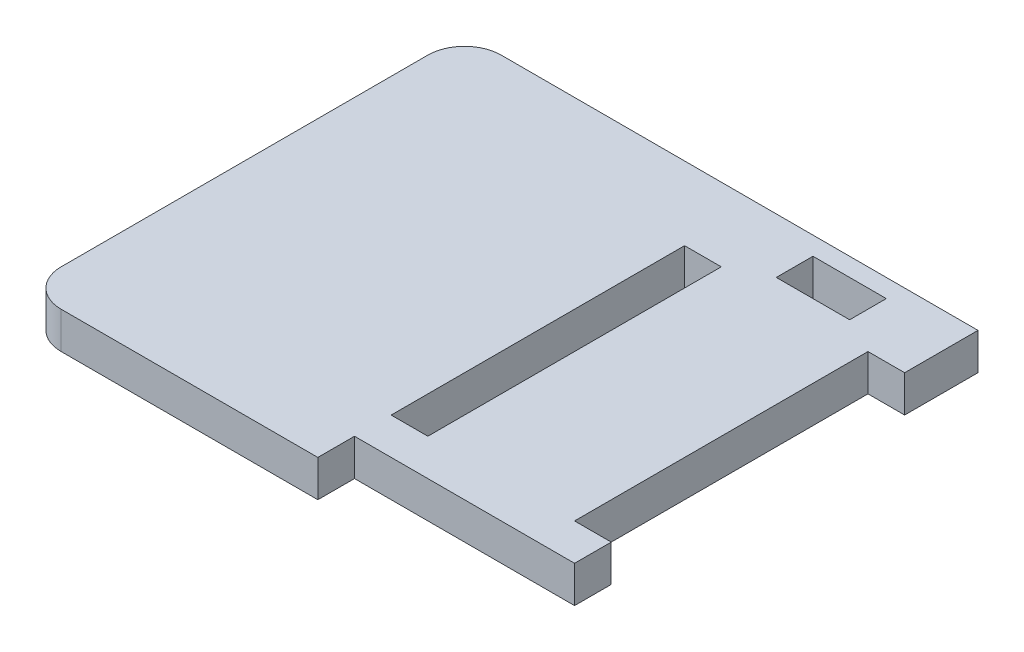
ISO-10303-21;
HEADER;
FILE_DESCRIPTION(('STEP AP214'),'2;1');
FILE_NAME('part.step','',(''),(''),'','','');
FILE_SCHEMA(('AUTOMOTIVE_DESIGN { 1 0 10303 214 1 1 1 1 }'));
ENDSEC;
DATA;
#1=APPLICATION_CONTEXT('core data for automotive mechanical design processes');
#2=APPLICATION_PROTOCOL_DEFINITION('international standard','automotive_design',2000,#1);
#3=PRODUCT_CONTEXT('',#1,'mechanical');
#4=PRODUCT('Part','Part','',(#3));
#5=PRODUCT_RELATED_PRODUCT_CATEGORY('part','',(#4));
#6=PRODUCT_DEFINITION_FORMATION('','',#4);
#7=PRODUCT_DEFINITION_CONTEXT('part definition',#1,'design');
#8=PRODUCT_DEFINITION('design','',#6,#7);
#9=PRODUCT_DEFINITION_SHAPE('','',#8);
#10=(LENGTH_UNIT() NAMED_UNIT(*) SI_UNIT(.MILLI.,.METRE.));
#11=(NAMED_UNIT(*) PLANE_ANGLE_UNIT() SI_UNIT($,.RADIAN.));
#12=(NAMED_UNIT(*) SI_UNIT($,.STERADIAN.) SOLID_ANGLE_UNIT());
#13=UNCERTAINTY_MEASURE_WITH_UNIT(LENGTH_MEASURE(1.E-05),#10,'distance_accuracy_value','');
#14=(GEOMETRIC_REPRESENTATION_CONTEXT(3) GLOBAL_UNCERTAINTY_ASSIGNED_CONTEXT((#13)) GLOBAL_UNIT_ASSIGNED_CONTEXT((#10,
#11,#12)) REPRESENTATION_CONTEXT('',''));
#15=CARTESIAN_POINT('',(0.,0.,0.));
#16=DIRECTION('',(0.,0.,1.));
#17=DIRECTION('',(1.,0.,0.));
#18=AXIS2_PLACEMENT_3D('',#15,#16,#17);
#19=CARTESIAN_POINT('',(44.45,3.175,38.1));
#20=DIRECTION('',(-1.,0.,0.));
#21=DIRECTION('',(0.,0.,1.));
#22=AXIS2_PLACEMENT_3D('',#19,#20,#21);
#23=PLANE('',#22);
#24=DIRECTION('',(0.,0.,-1.));
#25=VECTOR('',#24,1.);
#26=CARTESIAN_POINT('',(44.45,3.175,38.1));
#27=LINE('',#26,#25);
#28=CARTESIAN_POINT('',(44.45,3.175,31.75));
#29=VERTEX_POINT('',#28);
#30=CARTESIAN_POINT('',(44.45,3.175,25.4));
#31=VERTEX_POINT('',#30);
#32=EDGE_CURVE('E287',#29,#31,#27,.T.);
#33=ORIENTED_EDGE('',*,*,#32,.F.);
#34=DIRECTION('',(0.,-1.,0.));
#35=VECTOR('',#34,1.);
#36=CARTESIAN_POINT('',(44.45,3.175,31.75));
#37=LINE('',#36,#35);
#38=CARTESIAN_POINT('',(44.45,-3.175,31.75));
#39=VERTEX_POINT('',#38);
#40=EDGE_CURVE('E177',#29,#39,#37,.T.);
#41=ORIENTED_EDGE('',*,*,#40,.T.);
#42=DIRECTION('',(0.,0.,-1.));
#43=VECTOR('',#42,1.);
#44=CARTESIAN_POINT('',(44.45,-3.175,38.1));
#45=LINE('',#44,#43);
#46=CARTESIAN_POINT('',(44.45,-3.175,25.4));
#47=VERTEX_POINT('',#46);
#48=EDGE_CURVE('E300',#39,#47,#45,.T.);
#49=ORIENTED_EDGE('',*,*,#48,.T.);
#50=DIRECTION('',(0.,-1.,0.));
#51=VECTOR('',#50,1.);
#52=CARTESIAN_POINT('',(44.45,3.175,25.4));
#53=LINE('',#52,#51);
#54=EDGE_CURVE('E214',#31,#47,#53,.T.);
#55=ORIENTED_EDGE('',*,*,#54,.F.);
#56=EDGE_LOOP('',(#33,#41,#49,#55));
#57=FACE_BOUND('',#56,.T.);
#58=ADVANCED_FACE('F33',(#57),#23,.F.);
#59=CARTESIAN_POINT('',(-38.1,3.175,-31.75));
#60=DIRECTION('',(0.,1.,0.));
#61=DIRECTION('',(0.,0.,1.));
#62=AXIS2_PLACEMENT_3D('',#59,#60,#61);
#63=PLANE('',#62);
#64=DIRECTION('',(0.,0.,-1.));
#65=VECTOR('',#64,1.);
#66=CARTESIAN_POINT('',(6.35000000000002,3.175,0.));
#67=LINE('',#66,#65);
#68=CARTESIAN_POINT('',(6.35000000000002,3.175,38.1));
#69=VERTEX_POINT('',#68);
#70=CARTESIAN_POINT('',(6.35000000000002,3.175,31.75));
#71=VERTEX_POINT('',#70);
#72=EDGE_CURVE('E48',#69,#71,#67,.T.);
#73=ORIENTED_EDGE('',*,*,#72,.T.);
#74=DIRECTION('',(1.,0.,0.));
#75=VECTOR('',#74,1.);
#76=CARTESIAN_POINT('',(0.,3.175,31.75));
#77=LINE('',#76,#75);
#78=EDGE_CURVE('E178',#71,#29,#77,.T.);
#79=ORIENTED_EDGE('',*,*,#78,.T.);
#80=ORIENTED_EDGE('',*,*,#32,.T.);
#81=DIRECTION('',(1.,0.,0.));
#82=VECTOR('',#81,1.);
#83=CARTESIAN_POINT('',(0.,3.175,25.4));
#84=LINE('',#83,#82);
#85=CARTESIAN_POINT('',(38.1,3.175,25.4));
#86=VERTEX_POINT('',#85);
#87=EDGE_CURVE('E199',#86,#31,#84,.T.);
#88=ORIENTED_EDGE('',*,*,#87,.F.);
#89=DIRECTION('',(0.,0.,1.));
#90=VECTOR('',#89,1.);
#91=CARTESIAN_POINT('',(38.1,3.175,0.));
#92=LINE('',#91,#90);
#93=CARTESIAN_POINT('',(38.1,3.175,-25.4));
#94=VERTEX_POINT('',#93);
#95=EDGE_CURVE('E202',#94,#86,#92,.T.);
#96=ORIENTED_EDGE('',*,*,#95,.F.);
#97=DIRECTION('',(1.,0.,0.));
#98=VECTOR('',#97,1.);
#99=CARTESIAN_POINT('',(0.,3.175,-25.4));
#100=LINE('',#99,#98);
#101=CARTESIAN_POINT('',(44.45,3.175,-25.4));
#102=VERTEX_POINT('',#101);
#103=EDGE_CURVE('E205',#94,#102,#100,.T.);
#104=ORIENTED_EDGE('',*,*,#103,.T.);
#105=CARTESIAN_POINT('',(44.45,3.175,-38.1));
#106=VERTEX_POINT('',#105);
#107=EDGE_CURVE('E290',#102,#106,#27,.T.);
#108=ORIENTED_EDGE('',*,*,#107,.T.);
#109=DIRECTION('',(-1.,0.,0.));
#110=VECTOR('',#109,1.);
#111=CARTESIAN_POINT('',(44.45,3.175,-38.1));
#112=LINE('',#111,#110);
#113=CARTESIAN_POINT('',(-38.1,3.175,-38.1));
#114=VERTEX_POINT('',#113);
#115=EDGE_CURVE('E289',#106,#114,#112,.T.);
#116=ORIENTED_EDGE('',*,*,#115,.T.);
#117=CARTESIAN_POINT('',(-38.1,3.175,-31.75));
#118=DIRECTION('',(0.,1.,0.));
#119=DIRECTION('',(0.,0.,1.));
#120=AXIS2_PLACEMENT_3D('',#117,#118,#119);
#121=CIRCLE('',#120,6.35);
#122=CARTESIAN_POINT('',(-44.45,3.175,-31.75));
#123=VERTEX_POINT('',#122);
#124=EDGE_CURVE('E292',#114,#123,#121,.T.);
#125=ORIENTED_EDGE('',*,*,#124,.T.);
#126=DIRECTION('',(0.,0.,1.));
#127=VECTOR('',#126,1.);
#128=CARTESIAN_POINT('',(-44.45,3.175,31.75));
#129=LINE('',#128,#127);
#130=CARTESIAN_POINT('',(-44.45,3.175,31.75));
#131=VERTEX_POINT('',#130);
#132=EDGE_CURVE('E294',#123,#131,#129,.T.);
#133=ORIENTED_EDGE('',*,*,#132,.T.);
#134=CARTESIAN_POINT('',(-38.1,3.175,31.75));
#135=DIRECTION('',(0.,1.,0.));
#136=DIRECTION('',(0.,0.,-1.));
#137=AXIS2_PLACEMENT_3D('',#134,#135,#136);
#138=CIRCLE('',#137,6.35);
#139=CARTESIAN_POINT('',(-38.1,3.175,38.1));
#140=VERTEX_POINT('',#139);
#141=EDGE_CURVE('E296',#131,#140,#138,.T.);
#142=ORIENTED_EDGE('',*,*,#141,.T.);
#143=DIRECTION('',(1.,0.,0.));
#144=VECTOR('',#143,1.);
#145=CARTESIAN_POINT('',(44.45,3.175,38.1));
#146=LINE('',#145,#144);
#147=EDGE_CURVE('E190',#140,#69,#146,.T.);
#148=ORIENTED_EDGE('',*,*,#147,.T.);
#149=EDGE_LOOP('',(#73,#79,#80,#88,#96,#104,#108,#116,#125,#133,#142,#148));
#150=FACE_BOUND('',#149,.T.);
#151=DIRECTION('',(0.,0.,-1.));
#152=VECTOR('',#151,1.);
#153=CARTESIAN_POINT('',(6.35000000000001,3.175,0.));
#154=LINE('',#153,#152);
#155=CARTESIAN_POINT('',(6.35000000000001,3.175,25.4));
#156=VERTEX_POINT('',#155);
#157=CARTESIAN_POINT('',(6.35000000000001,3.175,-25.4));
#158=VERTEX_POINT('',#157);
#159=EDGE_CURVE('E255',#156,#158,#154,.T.);
#160=ORIENTED_EDGE('',*,*,#159,.T.);
#161=DIRECTION('',(1.,0.,0.));
#162=VECTOR('',#161,1.);
#163=CARTESIAN_POINT('',(0.,3.175,-25.4));
#164=LINE('',#163,#162);
#165=CARTESIAN_POINT('',(12.7,3.175,-25.4));
#166=VERTEX_POINT('',#165);
#167=EDGE_CURVE('E258',#158,#166,#164,.T.);
#168=ORIENTED_EDGE('',*,*,#167,.T.);
#169=DIRECTION('',(0.,0.,1.));
#170=VECTOR('',#169,1.);
#171=CARTESIAN_POINT('',(12.7,3.175,0.));
#172=LINE('',#171,#170);
#173=CARTESIAN_POINT('',(12.7,3.175,25.4));
#174=VERTEX_POINT('',#173);
#175=EDGE_CURVE('E262',#166,#174,#172,.T.);
#176=ORIENTED_EDGE('',*,*,#175,.T.);
#177=DIRECTION('',(-1.,0.,0.));
#178=VECTOR('',#177,1.);
#179=CARTESIAN_POINT('',(0.,3.175,25.4));
#180=LINE('',#179,#178);
#181=EDGE_CURVE('E265',#174,#156,#180,.T.);
#182=ORIENTED_EDGE('',*,*,#181,.T.);
#183=EDGE_LOOP('',(#160,#168,#176,#182));
#184=FACE_BOUND('',#183,.T.);
#185=DIRECTION('',(-1.,0.,0.));
#186=VECTOR('',#185,1.);
#187=CARTESIAN_POINT('',(0.,3.175,-28.575));
#188=LINE('',#187,#186);
#189=CARTESIAN_POINT('',(31.75,3.175,-28.575));
#190=VERTEX_POINT('',#189);
#191=CARTESIAN_POINT('',(19.05,3.175,-28.575));
#192=VERTEX_POINT('',#191);
#193=EDGE_CURVE('E223',#190,#192,#188,.T.);
#194=ORIENTED_EDGE('',*,*,#193,.T.);
#195=DIRECTION('',(0.,0.,-1.));
#196=VECTOR('',#195,1.);
#197=CARTESIAN_POINT('',(19.05,3.175,0.));
#198=LINE('',#197,#196);
#199=CARTESIAN_POINT('',(19.05,3.175,-34.925));
#200=VERTEX_POINT('',#199);
#201=EDGE_CURVE('E226',#192,#200,#198,.T.);
#202=ORIENTED_EDGE('',*,*,#201,.T.);
#203=DIRECTION('',(1.,0.,0.));
#204=VECTOR('',#203,1.);
#205=CARTESIAN_POINT('',(0.,3.175,-34.925));
#206=LINE('',#205,#204);
#207=CARTESIAN_POINT('',(31.75,3.175,-34.925));
#208=VERTEX_POINT('',#207);
#209=EDGE_CURVE('E230',#200,#208,#206,.T.);
#210=ORIENTED_EDGE('',*,*,#209,.T.);
#211=DIRECTION('',(0.,0.,1.));
#212=VECTOR('',#211,1.);
#213=CARTESIAN_POINT('',(31.75,3.175,0.));
#214=LINE('',#213,#212);
#215=EDGE_CURVE('E233',#208,#190,#214,.T.);
#216=ORIENTED_EDGE('',*,*,#215,.T.);
#217=EDGE_LOOP('',(#194,#202,#210,#216));
#218=FACE_BOUND('',#217,.T.);
#219=ADVANCED_FACE('F187',(#150,#184,#218),#63,.T.);
#220=CARTESIAN_POINT('',(-38.1,-3.175,-31.75));
#221=DIRECTION('',(0.,1.,0.));
#222=DIRECTION('',(0.,0.,1.));
#223=AXIS2_PLACEMENT_3D('',#220,#221,#222);
#224=PLANE('',#223);
#225=DIRECTION('',(1.,0.,0.));
#226=VECTOR('',#225,1.);
#227=CARTESIAN_POINT('',(0.,-3.175,-25.4));
#228=LINE('',#227,#226);
#229=CARTESIAN_POINT('',(6.35000000000001,-3.175,-25.4));
#230=VERTEX_POINT('',#229);
#231=CARTESIAN_POINT('',(12.7,-3.175,-25.4));
#232=VERTEX_POINT('',#231);
#233=EDGE_CURVE('E270',#230,#232,#228,.T.);
#234=ORIENTED_EDGE('',*,*,#233,.F.);
#235=DIRECTION('',(0.,0.,-1.));
#236=VECTOR('',#235,1.);
#237=CARTESIAN_POINT('',(6.35000000000001,-3.175,0.));
#238=LINE('',#237,#236);
#239=CARTESIAN_POINT('',(6.35000000000001,-3.175,25.4));
#240=VERTEX_POINT('',#239);
#241=EDGE_CURVE('E248',#240,#230,#238,.T.);
#242=ORIENTED_EDGE('',*,*,#241,.F.);
#243=DIRECTION('',(-1.,0.,0.));
#244=VECTOR('',#243,1.);
#245=CARTESIAN_POINT('',(0.,-3.175,25.4));
#246=LINE('',#245,#244);
#247=CARTESIAN_POINT('',(12.7,-3.175,25.4));
#248=VERTEX_POINT('',#247);
#249=EDGE_CURVE('E259',#248,#240,#246,.T.);
#250=ORIENTED_EDGE('',*,*,#249,.F.);
#251=DIRECTION('',(0.,0.,1.));
#252=VECTOR('',#251,1.);
#253=CARTESIAN_POINT('',(12.7,-3.175,0.));
#254=LINE('',#253,#252);
#255=EDGE_CURVE('E273',#232,#248,#254,.T.);
#256=ORIENTED_EDGE('',*,*,#255,.F.);
#257=EDGE_LOOP('',(#234,#242,#250,#256));
#258=FACE_BOUND('',#257,.T.);
#259=DIRECTION('',(0.,0.,-1.));
#260=VECTOR('',#259,1.);
#261=CARTESIAN_POINT('',(19.05,-3.175,0.));
#262=LINE('',#261,#260);
#263=CARTESIAN_POINT('',(19.05,-3.175,-28.575));
#264=VERTEX_POINT('',#263);
#265=CARTESIAN_POINT('',(19.05,-3.175,-34.925));
#266=VERTEX_POINT('',#265);
#267=EDGE_CURVE('E238',#264,#266,#262,.T.);
#268=ORIENTED_EDGE('',*,*,#267,.F.);
#269=DIRECTION('',(-1.,0.,0.));
#270=VECTOR('',#269,1.);
#271=CARTESIAN_POINT('',(0.,-3.175,-28.575));
#272=LINE('',#271,#270);
#273=CARTESIAN_POINT('',(31.75,-3.175,-28.575));
#274=VERTEX_POINT('',#273);
#275=EDGE_CURVE('E216',#274,#264,#272,.T.);
#276=ORIENTED_EDGE('',*,*,#275,.F.);
#277=DIRECTION('',(0.,0.,1.));
#278=VECTOR('',#277,1.);
#279=CARTESIAN_POINT('',(31.75,-3.175,0.));
#280=LINE('',#279,#278);
#281=CARTESIAN_POINT('',(31.75,-3.175,-34.925));
#282=VERTEX_POINT('',#281);
#283=EDGE_CURVE('E227',#282,#274,#280,.T.);
#284=ORIENTED_EDGE('',*,*,#283,.F.);
#285=DIRECTION('',(1.,0.,0.));
#286=VECTOR('',#285,1.);
#287=CARTESIAN_POINT('',(0.,-3.175,-34.925));
#288=LINE('',#287,#286);
#289=EDGE_CURVE('E241',#266,#282,#288,.T.);
#290=ORIENTED_EDGE('',*,*,#289,.F.);
#291=EDGE_LOOP('',(#268,#276,#284,#290));
#292=FACE_BOUND('',#291,.T.);
#293=DIRECTION('',(1.,0.,0.));
#294=VECTOR('',#293,1.);
#295=CARTESIAN_POINT('',(0.,-3.175,31.75));
#296=LINE('',#295,#294);
#297=CARTESIAN_POINT('',(6.35000000000002,-3.175,31.75));
#298=VERTEX_POINT('',#297);
#299=EDGE_CURVE('E191',#298,#39,#296,.T.);
#300=ORIENTED_EDGE('',*,*,#299,.F.);
#301=DIRECTION('',(0.,0.,-1.));
#302=VECTOR('',#301,1.);
#303=CARTESIAN_POINT('',(6.35000000000002,-3.175,0.));
#304=LINE('',#303,#302);
#305=CARTESIAN_POINT('',(6.35000000000002,-3.175,38.1));
#306=VERTEX_POINT('',#305);
#307=EDGE_CURVE('E174',#306,#298,#304,.T.);
#308=ORIENTED_EDGE('',*,*,#307,.F.);
#309=DIRECTION('',(1.,0.,0.));
#310=VECTOR('',#309,1.);
#311=CARTESIAN_POINT('',(44.45,-3.175,38.1));
#312=LINE('',#311,#310);
#313=CARTESIAN_POINT('',(-38.1,-3.175,38.1));
#314=VERTEX_POINT('',#313);
#315=EDGE_CURVE('E310',#314,#306,#312,.T.);
#316=ORIENTED_EDGE('',*,*,#315,.F.);
#317=CARTESIAN_POINT('',(-38.1,-3.175,31.75));
#318=DIRECTION('',(0.,1.,0.));
#319=DIRECTION('',(0.,0.,-1.));
#320=AXIS2_PLACEMENT_3D('',#317,#318,#319);
#321=CIRCLE('',#320,6.35);
#322=CARTESIAN_POINT('',(-44.45,-3.175,31.75));
#323=VERTEX_POINT('',#322);
#324=EDGE_CURVE('E308',#323,#314,#321,.T.);
#325=ORIENTED_EDGE('',*,*,#324,.F.);
#326=DIRECTION('',(0.,0.,1.));
#327=VECTOR('',#326,1.);
#328=CARTESIAN_POINT('',(-44.45,-3.175,31.75));
#329=LINE('',#328,#327);
#330=CARTESIAN_POINT('',(-44.45,-3.175,-31.75));
#331=VERTEX_POINT('',#330);
#332=EDGE_CURVE('E306',#331,#323,#329,.T.);
#333=ORIENTED_EDGE('',*,*,#332,.F.);
#334=CARTESIAN_POINT('',(-38.1,-3.175,-31.75));
#335=DIRECTION('',(0.,1.,0.));
#336=DIRECTION('',(0.,0.,1.));
#337=AXIS2_PLACEMENT_3D('',#334,#335,#336);
#338=CIRCLE('',#337,6.35);
#339=CARTESIAN_POINT('',(-38.1,-3.175,-38.1));
#340=VERTEX_POINT('',#339);
#341=EDGE_CURVE('E304',#340,#331,#338,.T.);
#342=ORIENTED_EDGE('',*,*,#341,.F.);
#343=DIRECTION('',(-1.,0.,0.));
#344=VECTOR('',#343,1.);
#345=CARTESIAN_POINT('',(44.45,-3.175,-38.1));
#346=LINE('',#345,#344);
#347=CARTESIAN_POINT('',(44.45,-3.175,-38.1));
#348=VERTEX_POINT('',#347);
#349=EDGE_CURVE('E302',#348,#340,#346,.T.);
#350=ORIENTED_EDGE('',*,*,#349,.F.);
#351=CARTESIAN_POINT('',(44.45,-3.175,-25.4));
#352=VERTEX_POINT('',#351);
#353=EDGE_CURVE('E280',#352,#348,#45,.T.);
#354=ORIENTED_EDGE('',*,*,#353,.F.);
#355=DIRECTION('',(1.,0.,0.));
#356=VECTOR('',#355,1.);
#357=CARTESIAN_POINT('',(0.,-3.175,-25.4));
#358=LINE('',#357,#356);
#359=CARTESIAN_POINT('',(38.1,-3.175,-25.4));
#360=VERTEX_POINT('',#359);
#361=EDGE_CURVE('E203',#360,#352,#358,.T.);
#362=ORIENTED_EDGE('',*,*,#361,.F.);
#363=DIRECTION('',(0.,0.,1.));
#364=VECTOR('',#363,1.);
#365=CARTESIAN_POINT('',(38.1,-3.175,0.));
#366=LINE('',#365,#364);
#367=CARTESIAN_POINT('',(38.1,-3.175,25.4));
#368=VERTEX_POINT('',#367);
#369=EDGE_CURVE('E210',#360,#368,#366,.T.);
#370=ORIENTED_EDGE('',*,*,#369,.T.);
#371=DIRECTION('',(1.,0.,0.));
#372=VECTOR('',#371,1.);
#373=CARTESIAN_POINT('',(0.,-3.175,25.4));
#374=LINE('',#373,#372);
#375=EDGE_CURVE('E56',#368,#47,#374,.T.);
#376=ORIENTED_EDGE('',*,*,#375,.T.);
#377=ORIENTED_EDGE('',*,*,#48,.F.);
#378=EDGE_LOOP('',(#300,#308,#316,#325,#333,#342,#350,#354,#362,#370,#376,#377));
#379=FACE_BOUND('',#378,.T.);
#380=ADVANCED_FACE('F332',(#258,#292,#379),#224,.F.);
#381=ORIENTED_EDGE('',*,*,#107,.F.);
#382=DIRECTION('',(0.,-1.,0.));
#383=VECTOR('',#382,1.);
#384=CARTESIAN_POINT('',(44.45,3.175,-25.4));
#385=LINE('',#384,#383);
#386=EDGE_CURVE('E217',#102,#352,#385,.T.);
#387=ORIENTED_EDGE('',*,*,#386,.T.);
#388=ORIENTED_EDGE('',*,*,#353,.T.);
#389=DIRECTION('',(0.,-1.,0.));
#390=VECTOR('',#389,1.);
#391=CARTESIAN_POINT('',(44.45,3.175,-38.1));
#392=LINE('',#391,#390);
#393=EDGE_CURVE('E11',#106,#348,#392,.T.);
#394=ORIENTED_EDGE('',*,*,#393,.F.);
#395=EDGE_LOOP('',(#381,#387,#388,#394));
#396=FACE_BOUND('',#395,.T.);
#397=ADVANCED_FACE('F35',(#396),#23,.F.);
#398=CARTESIAN_POINT('',(44.45,3.175,-38.1));
#399=DIRECTION('',(0.,0.,1.));
#400=DIRECTION('',(1.,0.,0.));
#401=AXIS2_PLACEMENT_3D('',#398,#399,#400);
#402=PLANE('',#401);
#403=ORIENTED_EDGE('',*,*,#349,.T.);
#404=DIRECTION('',(0.,-1.,0.));
#405=VECTOR('',#404,1.);
#406=CARTESIAN_POINT('',(-38.1,3.175,-38.1));
#407=LINE('',#406,#405);
#408=EDGE_CURVE('E41',#114,#340,#407,.T.);
#409=ORIENTED_EDGE('',*,*,#408,.F.);
#410=ORIENTED_EDGE('',*,*,#115,.F.);
#411=ORIENTED_EDGE('',*,*,#393,.T.);
#412=EDGE_LOOP('',(#403,#409,#410,#411));
#413=FACE_BOUND('',#412,.T.);
#414=ADVANCED_FACE('F346',(#413),#402,.F.);
#415=CARTESIAN_POINT('',(-38.1,3.175,-31.75));
#416=DIRECTION('',(0.,-1.,0.));
#417=DIRECTION('',(0.,0.,-1.));
#418=AXIS2_PLACEMENT_3D('',#415,#416,#417);
#419=CYLINDRICAL_SURFACE('',#418,6.35);
#420=ORIENTED_EDGE('',*,*,#341,.T.);
#421=DIRECTION('',(0.,-1.,0.));
#422=VECTOR('',#421,1.);
#423=CARTESIAN_POINT('',(-44.45,3.175,-31.75));
#424=LINE('',#423,#422);
#425=EDGE_CURVE('E318',#123,#331,#424,.T.);
#426=ORIENTED_EDGE('',*,*,#425,.F.);
#427=ORIENTED_EDGE('',*,*,#124,.F.);
#428=ORIENTED_EDGE('',*,*,#408,.T.);
#429=EDGE_LOOP('',(#420,#426,#427,#428));
#430=FACE_BOUND('',#429,.T.);
#431=ADVANCED_FACE('F325',(#430),#419,.T.);
#432=CARTESIAN_POINT('',(-44.45,3.175,31.75));
#433=DIRECTION('',(1.,0.,0.));
#434=DIRECTION('',(0.,0.,-1.));
#435=AXIS2_PLACEMENT_3D('',#432,#433,#434);
#436=PLANE('',#435);
#437=ORIENTED_EDGE('',*,*,#332,.T.);
#438=DIRECTION('',(0.,-1.,0.));
#439=VECTOR('',#438,1.);
#440=CARTESIAN_POINT('',(-44.45,3.175,31.75));
#441=LINE('',#440,#439);
#442=EDGE_CURVE('E315',#131,#323,#441,.T.);
#443=ORIENTED_EDGE('',*,*,#442,.F.);
#444=ORIENTED_EDGE('',*,*,#132,.F.);
#445=ORIENTED_EDGE('',*,*,#425,.T.);
#446=EDGE_LOOP('',(#437,#443,#444,#445));
#447=FACE_BOUND('',#446,.T.);
#448=ADVANCED_FACE('F338',(#447),#436,.F.);
#449=CARTESIAN_POINT('',(-38.1,3.175,31.75));
#450=DIRECTION('',(0.,-1.,0.));
#451=DIRECTION('',(0.,0.,-1.));
#452=AXIS2_PLACEMENT_3D('',#449,#450,#451);
#453=CYLINDRICAL_SURFACE('',#452,6.35);
#454=ORIENTED_EDGE('',*,*,#324,.T.);
#455=DIRECTION('',(0.,-1.,0.));
#456=VECTOR('',#455,1.);
#457=CARTESIAN_POINT('',(-38.1,3.175,38.1));
#458=LINE('',#457,#456);
#459=EDGE_CURVE('E299',#140,#314,#458,.T.);
#460=ORIENTED_EDGE('',*,*,#459,.F.);
#461=ORIENTED_EDGE('',*,*,#141,.F.);
#462=ORIENTED_EDGE('',*,*,#442,.T.);
#463=EDGE_LOOP('',(#454,#460,#461,#462));
#464=FACE_BOUND('',#463,.T.);
#465=ADVANCED_FACE('F342',(#464),#453,.T.);
#466=CARTESIAN_POINT('',(44.45,3.175,38.1));
#467=DIRECTION('',(0.,0.,-1.));
#468=DIRECTION('',(-1.,0.,0.));
#469=AXIS2_PLACEMENT_3D('',#466,#467,#468);
#470=PLANE('',#469);
#471=ORIENTED_EDGE('',*,*,#315,.T.);
#472=DIRECTION('',(0.,-1.,0.));
#473=VECTOR('',#472,1.);
#474=CARTESIAN_POINT('',(6.35000000000002,3.175,38.1));
#475=LINE('',#474,#473);
#476=EDGE_CURVE('E196',#69,#306,#475,.T.);
#477=ORIENTED_EDGE('',*,*,#476,.F.);
#478=ORIENTED_EDGE('',*,*,#147,.F.);
#479=ORIENTED_EDGE('',*,*,#459,.T.);
#480=EDGE_LOOP('',(#471,#477,#478,#479));
#481=FACE_BOUND('',#480,.T.);
#482=ADVANCED_FACE('F362',(#481),#470,.F.);
#483=CARTESIAN_POINT('',(6.35000000000001,3.175,0.));
#484=DIRECTION('',(-1.,0.,0.));
#485=DIRECTION('',(0.,0.,1.));
#486=AXIS2_PLACEMENT_3D('',#483,#484,#485);
#487=PLANE('',#486);
#488=ORIENTED_EDGE('',*,*,#241,.T.);
#489=DIRECTION('',(0.,-1.,0.));
#490=VECTOR('',#489,1.);
#491=CARTESIAN_POINT('',(6.35000000000001,3.175,-25.4));
#492=LINE('',#491,#490);
#493=EDGE_CURVE('E268',#158,#230,#492,.T.);
#494=ORIENTED_EDGE('',*,*,#493,.F.);
#495=ORIENTED_EDGE('',*,*,#159,.F.);
#496=DIRECTION('',(0.,-1.,0.));
#497=VECTOR('',#496,1.);
#498=CARTESIAN_POINT('',(6.35000000000001,3.175,25.4));
#499=LINE('',#498,#497);
#500=EDGE_CURVE('E278',#156,#240,#499,.T.);
#501=ORIENTED_EDGE('',*,*,#500,.T.);
#502=EDGE_LOOP('',(#488,#494,#495,#501));
#503=FACE_BOUND('',#502,.T.);
#504=ADVANCED_FACE('F364',(#503),#487,.F.);
#505=CARTESIAN_POINT('',(0.,3.175,25.4));
#506=DIRECTION('',(0.,0.,1.));
#507=DIRECTION('',(1.,0.,0.));
#508=AXIS2_PLACEMENT_3D('',#505,#506,#507);
#509=PLANE('',#508);
#510=ORIENTED_EDGE('',*,*,#249,.T.);
#511=ORIENTED_EDGE('',*,*,#500,.F.);
#512=ORIENTED_EDGE('',*,*,#181,.F.);
#513=DIRECTION('',(0.,-1.,0.));
#514=VECTOR('',#513,1.);
#515=CARTESIAN_POINT('',(12.7,3.175,25.4));
#516=LINE('',#515,#514);
#517=EDGE_CURVE('E281',#174,#248,#516,.T.);
#518=ORIENTED_EDGE('',*,*,#517,.T.);
#519=EDGE_LOOP('',(#510,#511,#512,#518));
#520=FACE_BOUND('',#519,.T.);
#521=ADVANCED_FACE('F370',(#520),#509,.F.);
#522=CARTESIAN_POINT('',(12.7,3.175,0.));
#523=DIRECTION('',(1.,0.,0.));
#524=DIRECTION('',(0.,0.,-1.));
#525=AXIS2_PLACEMENT_3D('',#522,#523,#524);
#526=PLANE('',#525);
#527=ORIENTED_EDGE('',*,*,#255,.T.);
#528=ORIENTED_EDGE('',*,*,#517,.F.);
#529=ORIENTED_EDGE('',*,*,#175,.F.);
#530=DIRECTION('',(0.,-1.,0.));
#531=VECTOR('',#530,1.);
#532=CARTESIAN_POINT('',(12.7,3.175,-25.4));
#533=LINE('',#532,#531);
#534=EDGE_CURVE('E283',#166,#232,#533,.T.);
#535=ORIENTED_EDGE('',*,*,#534,.T.);
#536=EDGE_LOOP('',(#527,#528,#529,#535));
#537=FACE_BOUND('',#536,.T.);
#538=ADVANCED_FACE('F395',(#537),#526,.F.);
#539=CARTESIAN_POINT('',(0.,3.175,-25.4));
#540=DIRECTION('',(0.,0.,-1.));
#541=DIRECTION('',(-1.,0.,0.));
#542=AXIS2_PLACEMENT_3D('',#539,#540,#541);
#543=PLANE('',#542);
#544=ORIENTED_EDGE('',*,*,#233,.T.);
#545=ORIENTED_EDGE('',*,*,#534,.F.);
#546=ORIENTED_EDGE('',*,*,#167,.F.);
#547=ORIENTED_EDGE('',*,*,#493,.T.);
#548=EDGE_LOOP('',(#544,#545,#546,#547));
#549=FACE_BOUND('',#548,.T.);
#550=ADVANCED_FACE('F391',(#549),#543,.F.);
#551=CARTESIAN_POINT('',(0.,3.175,-28.575));
#552=DIRECTION('',(0.,0.,1.));
#553=DIRECTION('',(1.,0.,0.));
#554=AXIS2_PLACEMENT_3D('',#551,#552,#553);
#555=PLANE('',#554);
#556=ORIENTED_EDGE('',*,*,#275,.T.);
#557=DIRECTION('',(0.,-1.,0.));
#558=VECTOR('',#557,1.);
#559=CARTESIAN_POINT('',(19.05,3.175,-28.575));
#560=LINE('',#559,#558);
#561=EDGE_CURVE('E236',#192,#264,#560,.T.);
#562=ORIENTED_EDGE('',*,*,#561,.F.);
#563=ORIENTED_EDGE('',*,*,#193,.F.);
#564=DIRECTION('',(0.,-1.,0.));
#565=VECTOR('',#564,1.);
#566=CARTESIAN_POINT('',(31.75,3.175,-28.575));
#567=LINE('',#566,#565);
#568=EDGE_CURVE('E246',#190,#274,#567,.T.);
#569=ORIENTED_EDGE('',*,*,#568,.T.);
#570=EDGE_LOOP('',(#556,#562,#563,#569));
#571=FACE_BOUND('',#570,.T.);
#572=ADVANCED_FACE('F394',(#571),#555,.F.);
#573=CARTESIAN_POINT('',(31.75,3.175,0.));
#574=DIRECTION('',(1.,0.,0.));
#575=DIRECTION('',(0.,0.,-1.));
#576=AXIS2_PLACEMENT_3D('',#573,#574,#575);
#577=PLANE('',#576);
#578=ORIENTED_EDGE('',*,*,#283,.T.);
#579=ORIENTED_EDGE('',*,*,#568,.F.);
#580=ORIENTED_EDGE('',*,*,#215,.F.);
#581=DIRECTION('',(0.,-1.,0.));
#582=VECTOR('',#581,1.);
#583=CARTESIAN_POINT('',(31.75,3.175,-34.925));
#584=LINE('',#583,#582);
#585=EDGE_CURVE('E249',#208,#282,#584,.T.);
#586=ORIENTED_EDGE('',*,*,#585,.T.);
#587=EDGE_LOOP('',(#578,#579,#580,#586));
#588=FACE_BOUND('',#587,.T.);
#589=ADVANCED_FACE('F405',(#588),#577,.F.);
#590=CARTESIAN_POINT('',(0.,3.175,-34.925));
#591=DIRECTION('',(0.,0.,-1.));
#592=DIRECTION('',(-1.,0.,0.));
#593=AXIS2_PLACEMENT_3D('',#590,#591,#592);
#594=PLANE('',#593);
#595=ORIENTED_EDGE('',*,*,#289,.T.);
#596=ORIENTED_EDGE('',*,*,#585,.F.);
#597=ORIENTED_EDGE('',*,*,#209,.F.);
#598=DIRECTION('',(0.,-1.,0.));
#599=VECTOR('',#598,1.);
#600=CARTESIAN_POINT('',(19.05,3.175,-34.925));
#601=LINE('',#600,#599);
#602=EDGE_CURVE('E251',#200,#266,#601,.T.);
#603=ORIENTED_EDGE('',*,*,#602,.T.);
#604=EDGE_LOOP('',(#595,#596,#597,#603));
#605=FACE_BOUND('',#604,.T.);
#606=ADVANCED_FACE('F410',(#605),#594,.F.);
#607=CARTESIAN_POINT('',(19.05,3.175,0.));
#608=DIRECTION('',(-1.,0.,0.));
#609=DIRECTION('',(0.,0.,1.));
#610=AXIS2_PLACEMENT_3D('',#607,#608,#609);
#611=PLANE('',#610);
#612=ORIENTED_EDGE('',*,*,#267,.T.);
#613=ORIENTED_EDGE('',*,*,#602,.F.);
#614=ORIENTED_EDGE('',*,*,#201,.F.);
#615=ORIENTED_EDGE('',*,*,#561,.T.);
#616=EDGE_LOOP('',(#612,#613,#614,#615));
#617=FACE_BOUND('',#616,.T.);
#618=ADVANCED_FACE('F407',(#617),#611,.F.);
#619=CARTESIAN_POINT('',(0.,3.175,25.4));
#620=DIRECTION('',(0.,0.,-1.));
#621=DIRECTION('',(-1.,0.,0.));
#622=AXIS2_PLACEMENT_3D('',#619,#620,#621);
#623=PLANE('',#622);
#624=ORIENTED_EDGE('',*,*,#375,.F.);
#625=DIRECTION('',(0.,-1.,0.));
#626=VECTOR('',#625,1.);
#627=CARTESIAN_POINT('',(38.1,3.175,25.4));
#628=LINE('',#627,#626);
#629=EDGE_CURVE('E208',#86,#368,#628,.T.);
#630=ORIENTED_EDGE('',*,*,#629,.F.);
#631=ORIENTED_EDGE('',*,*,#87,.T.);
#632=ORIENTED_EDGE('',*,*,#54,.T.);
#633=EDGE_LOOP('',(#624,#630,#631,#632));
#634=FACE_BOUND('',#633,.T.);
#635=ADVANCED_FACE('F357',(#634),#623,.T.);
#636=CARTESIAN_POINT('',(0.,3.175,-25.4));
#637=DIRECTION('',(0.,0.,-1.));
#638=DIRECTION('',(-1.,0.,0.));
#639=AXIS2_PLACEMENT_3D('',#636,#637,#638);
#640=PLANE('',#639);
#641=ORIENTED_EDGE('',*,*,#361,.T.);
#642=ORIENTED_EDGE('',*,*,#386,.F.);
#643=ORIENTED_EDGE('',*,*,#103,.F.);
#644=DIRECTION('',(0.,-1.,0.));
#645=VECTOR('',#644,1.);
#646=CARTESIAN_POINT('',(38.1,3.175,-25.4));
#647=LINE('',#646,#645);
#648=EDGE_CURVE('E220',#94,#360,#647,.T.);
#649=ORIENTED_EDGE('',*,*,#648,.T.);
#650=EDGE_LOOP('',(#641,#642,#643,#649));
#651=FACE_BOUND('',#650,.T.);
#652=ADVANCED_FACE('F351',(#651),#640,.F.);
#653=CARTESIAN_POINT('',(38.1,3.175,0.));
#654=DIRECTION('',(1.,0.,0.));
#655=DIRECTION('',(0.,0.,-1.));
#656=AXIS2_PLACEMENT_3D('',#653,#654,#655);
#657=PLANE('',#656);
#658=ORIENTED_EDGE('',*,*,#369,.F.);
#659=ORIENTED_EDGE('',*,*,#648,.F.);
#660=ORIENTED_EDGE('',*,*,#95,.T.);
#661=ORIENTED_EDGE('',*,*,#629,.T.);
#662=EDGE_LOOP('',(#658,#659,#660,#661));
#663=FACE_BOUND('',#662,.T.);
#664=ADVANCED_FACE('F355',(#663),#657,.T.);
#665=CARTESIAN_POINT('',(6.35000000000002,3.175,0.));
#666=DIRECTION('',(-1.,0.,0.));
#667=DIRECTION('',(0.,0.,1.));
#668=AXIS2_PLACEMENT_3D('',#665,#666,#667);
#669=PLANE('',#668);
#670=ORIENTED_EDGE('',*,*,#307,.T.);
#671=DIRECTION('',(0.,-1.,0.));
#672=VECTOR('',#671,1.);
#673=CARTESIAN_POINT('',(6.35000000000002,3.175,31.75));
#674=LINE('',#673,#672);
#675=EDGE_CURVE('E170',#71,#298,#674,.T.);
#676=ORIENTED_EDGE('',*,*,#675,.F.);
#677=ORIENTED_EDGE('',*,*,#72,.F.);
#678=ORIENTED_EDGE('',*,*,#476,.T.);
#679=EDGE_LOOP('',(#670,#676,#677,#678));
#680=FACE_BOUND('',#679,.T.);
#681=ADVANCED_FACE('F172',(#680),#669,.F.);
#682=CARTESIAN_POINT('',(0.,3.175,31.75));
#683=DIRECTION('',(0.,0.,-1.));
#684=DIRECTION('',(-1.,0.,0.));
#685=AXIS2_PLACEMENT_3D('',#682,#683,#684);
#686=PLANE('',#685);
#687=ORIENTED_EDGE('',*,*,#299,.T.);
#688=ORIENTED_EDGE('',*,*,#40,.F.);
#689=ORIENTED_EDGE('',*,*,#78,.F.);
#690=ORIENTED_EDGE('',*,*,#675,.T.);
#691=EDGE_LOOP('',(#687,#688,#689,#690));
#692=FACE_BOUND('',#691,.T.);
#693=ADVANCED_FACE('F181',(#692),#686,.F.);
#694=CLOSED_SHELL('',(#58,#219,#380,#397,#414,#431,#448,#465,#482,#504,#521,#538,#550,#572,#589,
#606,#618,#635,#652,#664,#681,#693));
#695=MANIFOLD_SOLID_BREP('B2',#694);
#696=ADVANCED_BREP_SHAPE_REPRESENTATION('',(#18,#695),#14);
#697=SHAPE_DEFINITION_REPRESENTATION(#9,#696);
ENDSEC;
END-ISO-10303-21;
